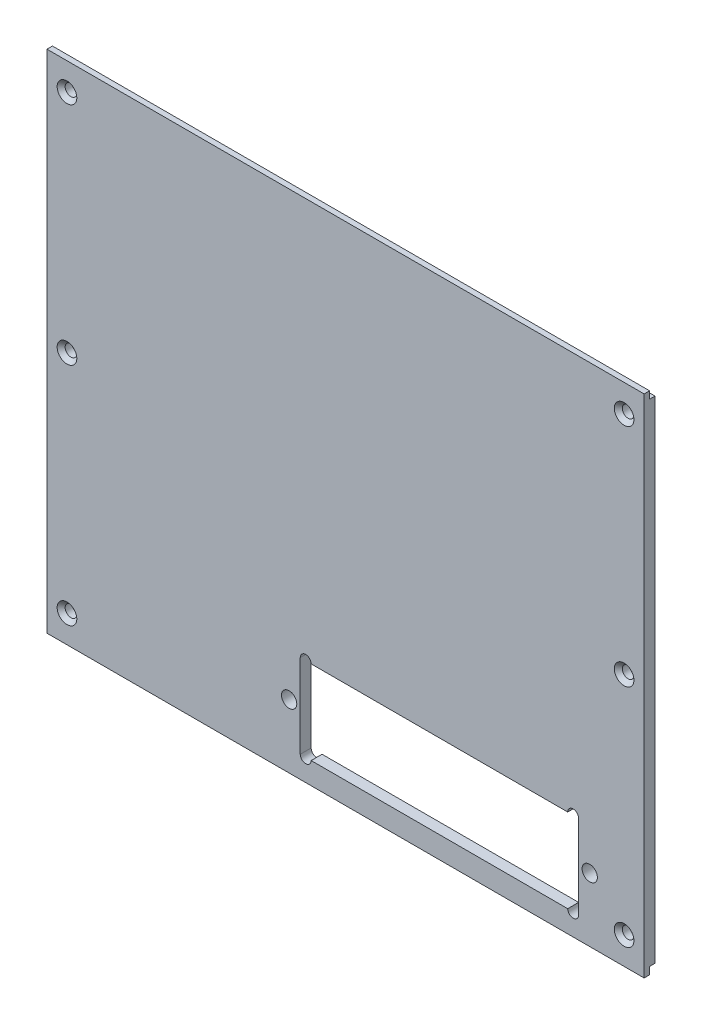
ISO-10303-21;
HEADER;
FILE_DESCRIPTION(('STEP AP214'),'2;1');
FILE_NAME('part.step','',(''),(''),'','','');
FILE_SCHEMA(('AUTOMOTIVE_DESIGN { 1 0 10303 214 1 1 1 1 }'));
ENDSEC;
DATA;
#1=APPLICATION_CONTEXT('core data for automotive mechanical design processes');
#2=APPLICATION_PROTOCOL_DEFINITION('international standard','automotive_design',2000,#1);
#3=PRODUCT_CONTEXT('',#1,'mechanical');
#4=PRODUCT('Part','Part','',(#3));
#5=PRODUCT_RELATED_PRODUCT_CATEGORY('part','',(#4));
#6=PRODUCT_DEFINITION_FORMATION('','',#4);
#7=PRODUCT_DEFINITION_CONTEXT('part definition',#1,'design');
#8=PRODUCT_DEFINITION('design','',#6,#7);
#9=PRODUCT_DEFINITION_SHAPE('','',#8);
#10=(LENGTH_UNIT() NAMED_UNIT(*) SI_UNIT(.MILLI.,.METRE.));
#11=(NAMED_UNIT(*) PLANE_ANGLE_UNIT() SI_UNIT($,.RADIAN.));
#12=(NAMED_UNIT(*) SI_UNIT($,.STERADIAN.) SOLID_ANGLE_UNIT());
#13=UNCERTAINTY_MEASURE_WITH_UNIT(LENGTH_MEASURE(1.E-05),#10,'distance_accuracy_value','');
#14=(GEOMETRIC_REPRESENTATION_CONTEXT(3) GLOBAL_UNCERTAINTY_ASSIGNED_CONTEXT((#13)) GLOBAL_UNIT_ASSIGNED_CONTEXT((#10,
#11,#12)) REPRESENTATION_CONTEXT('',''));
#15=CARTESIAN_POINT('',(0.,0.,0.));
#16=DIRECTION('',(0.,0.,1.));
#17=DIRECTION('',(1.,0.,0.));
#18=AXIS2_PLACEMENT_3D('',#15,#16,#17);
#19=CARTESIAN_POINT('',(-82.05,69.5,3.));
#20=DIRECTION('',(0.,-1.,0.));
#21=DIRECTION('',(0.,0.,-1.));
#22=AXIS2_PLACEMENT_3D('',#19,#20,#21);
#23=PLANE('',#22);
#24=DIRECTION('',(1.,0.,0.));
#25=VECTOR('',#24,1.);
#26=CARTESIAN_POINT('',(82.05,69.5,1.5));
#27=LINE('',#26,#25);
#28=CARTESIAN_POINT('',(-82.05,69.5,1.5));
#29=VERTEX_POINT('',#28);
#30=CARTESIAN_POINT('',(82.05,69.5,1.5));
#31=VERTEX_POINT('',#30);
#32=EDGE_CURVE('E364',#29,#31,#27,.T.);
#33=ORIENTED_EDGE('',*,*,#32,.F.);
#34=DIRECTION('',(0.,0.,-1.));
#35=VECTOR('',#34,1.);
#36=CARTESIAN_POINT('',(-82.05,69.5,3.));
#37=LINE('',#36,#35);
#38=CARTESIAN_POINT('',(-82.05,69.5,3.));
#39=VERTEX_POINT('',#38);
#40=EDGE_CURVE('E183',#39,#29,#37,.T.);
#41=ORIENTED_EDGE('',*,*,#40,.F.);
#42=DIRECTION('',(-1.,0.,0.));
#43=VECTOR('',#42,1.);
#44=CARTESIAN_POINT('',(-82.05,69.5,3.));
#45=LINE('',#44,#43);
#46=CARTESIAN_POINT('',(82.05,69.5,3.));
#47=VERTEX_POINT('',#46);
#48=EDGE_CURVE('E188',#47,#39,#45,.T.);
#49=ORIENTED_EDGE('',*,*,#48,.F.);
#50=DIRECTION('',(0.,0.,-1.));
#51=VECTOR('',#50,1.);
#52=CARTESIAN_POINT('',(82.05,69.5,3.));
#53=LINE('',#52,#51);
#54=EDGE_CURVE('E181',#47,#31,#53,.T.);
#55=ORIENTED_EDGE('',*,*,#54,.T.);
#56=EDGE_LOOP('',(#33,#41,#49,#55));
#57=FACE_BOUND('',#56,.T.);
#58=ADVANCED_FACE('F38',(#57),#23,.F.);
#59=CARTESIAN_POINT('',(0.,0.,3.));
#60=DIRECTION('',(0.,0.,-1.));
#61=DIRECTION('',(-1.,0.,0.));
#62=AXIS2_PLACEMENT_3D('',#59,#60,#61);
#63=PLANE('',#62);
#64=CARTESIAN_POINT('',(67.1,-52.,3.));
#65=DIRECTION('',(0.,0.,1.));
#66=DIRECTION('',(-1.,0.,0.));
#67=AXIS2_PLACEMENT_3D('',#64,#65,#66);
#68=CIRCLE('',#67,2.09999999999999);
#69=CARTESIAN_POINT('',(69.2,-52.,3.));
#70=VERTEX_POINT('',#69);
#71=EDGE_CURVE('E316',#70,#70,#68,.T.);
#72=ORIENTED_EDGE('',*,*,#71,.F.);
#73=EDGE_LOOP('',(#72));
#74=FACE_BOUND('',#73,.T.);
#75=CARTESIAN_POINT('',(-15.5,-52.,3.));
#76=DIRECTION('',(0.,0.,1.));
#77=DIRECTION('',(1.,0.,0.));
#78=AXIS2_PLACEMENT_3D('',#75,#76,#77);
#79=CIRCLE('',#78,2.1);
#80=CARTESIAN_POINT('',(-13.4,-52.,3.));
#81=VERTEX_POINT('',#80);
#82=EDGE_CURVE('E311',#81,#81,#79,.T.);
#83=ORIENTED_EDGE('',*,*,#82,.F.);
#84=EDGE_LOOP('',(#83));
#85=FACE_BOUND('',#84,.T.);
#86=DIRECTION('',(-1.,0.,0.));
#87=VECTOR('',#86,1.);
#88=CARTESIAN_POINT('',(-12.45,-40.5,3.));
#89=LINE('',#88,#87);
#90=CARTESIAN_POINT('',(61.05,-40.5,3.));
#91=VERTEX_POINT('',#90);
#92=CARTESIAN_POINT('',(-9.44999999999999,-40.5,3.));
#93=VERTEX_POINT('',#92);
#94=EDGE_CURVE('E278',#91,#93,#89,.T.);
#95=ORIENTED_EDGE('',*,*,#94,.F.);
#96=CARTESIAN_POINT('',(62.55,-40.5,3.));
#97=DIRECTION('',(0.,0.,1.));
#98=DIRECTION('',(-1.,0.,0.));
#99=AXIS2_PLACEMENT_3D('',#96,#97,#98);
#100=CIRCLE('',#99,1.5);
#101=CARTESIAN_POINT('',(64.05,-40.5,3.));
#102=VERTEX_POINT('',#101);
#103=EDGE_CURVE('E358',#102,#91,#100,.T.);
#104=ORIENTED_EDGE('',*,*,#103,.F.);
#105=DIRECTION('',(0.,1.,0.));
#106=VECTOR('',#105,1.);
#107=CARTESIAN_POINT('',(64.05,-40.5,3.));
#108=LINE('',#107,#106);
#109=CARTESIAN_POINT('',(64.05,-63.5,3.));
#110=VERTEX_POINT('',#109);
#111=EDGE_CURVE('E288',#110,#102,#108,.T.);
#112=ORIENTED_EDGE('',*,*,#111,.F.);
#113=CARTESIAN_POINT('',(62.55,-63.5,3.));
#114=DIRECTION('',(0.,0.,1.));
#115=DIRECTION('',(-1.,0.,0.));
#116=AXIS2_PLACEMENT_3D('',#113,#114,#115);
#117=CIRCLE('',#116,1.5);
#118=CARTESIAN_POINT('',(61.05,-63.5,3.));
#119=VERTEX_POINT('',#118);
#120=EDGE_CURVE('E334',#119,#110,#117,.T.);
#121=ORIENTED_EDGE('',*,*,#120,.F.);
#122=DIRECTION('',(1.,0.,0.));
#123=VECTOR('',#122,1.);
#124=CARTESIAN_POINT('',(-12.45,-63.5,3.));
#125=LINE('',#124,#123);
#126=CARTESIAN_POINT('',(-9.44999999999999,-63.5,3.));
#127=VERTEX_POINT('',#126);
#128=EDGE_CURVE('E292',#127,#119,#125,.T.);
#129=ORIENTED_EDGE('',*,*,#128,.F.);
#130=CARTESIAN_POINT('',(-10.95,-63.5,3.));
#131=DIRECTION('',(0.,0.,1.));
#132=DIRECTION('',(1.,0.,0.));
#133=AXIS2_PLACEMENT_3D('',#130,#131,#132);
#134=CIRCLE('',#133,1.5);
#135=CARTESIAN_POINT('',(-12.45,-63.5,3.));
#136=VERTEX_POINT('',#135);
#137=EDGE_CURVE('E323',#136,#127,#134,.T.);
#138=ORIENTED_EDGE('',*,*,#137,.F.);
#139=DIRECTION('',(0.,-1.,0.));
#140=VECTOR('',#139,1.);
#141=CARTESIAN_POINT('',(-12.45,-40.5,3.));
#142=LINE('',#141,#140);
#143=CARTESIAN_POINT('',(-12.45,-40.5,3.));
#144=VERTEX_POINT('',#143);
#145=EDGE_CURVE('E296',#144,#136,#142,.T.);
#146=ORIENTED_EDGE('',*,*,#145,.F.);
#147=CARTESIAN_POINT('',(-10.95,-40.5,3.));
#148=DIRECTION('',(0.,0.,1.));
#149=DIRECTION('',(1.,0.,0.));
#150=AXIS2_PLACEMENT_3D('',#147,#148,#149);
#151=CIRCLE('',#150,1.5);
#152=EDGE_CURVE('E346',#93,#144,#151,.T.);
#153=ORIENTED_EDGE('',*,*,#152,.F.);
#154=EDGE_LOOP('',(#95,#104,#112,#121,#129,#138,#146,#153));
#155=FACE_BOUND('',#154,.T.);
#156=CARTESIAN_POINT('',(-76.55,0.,3.));
#157=DIRECTION('',(0.,0.,1.));
#158=DIRECTION('',(1.,0.,0.));
#159=AXIS2_PLACEMENT_3D('',#156,#157,#158);
#160=CIRCLE('',#159,2.700000061);
#161=CARTESIAN_POINT('',(-73.849999939,0.,3.));
#162=VERTEX_POINT('',#161);
#163=EDGE_CURVE('E256',#162,#162,#160,.T.);
#164=ORIENTED_EDGE('',*,*,#163,.F.);
#165=EDGE_LOOP('',(#164));
#166=FACE_BOUND('',#165,.T.);
#167=CARTESIAN_POINT('',(-76.55,-62.,3.));
#168=DIRECTION('',(0.,0.,1.));
#169=DIRECTION('',(1.,0.,0.));
#170=AXIS2_PLACEMENT_3D('',#167,#168,#169);
#171=CIRCLE('',#170,2.700000061);
#172=CARTESIAN_POINT('',(-73.849999939,-62.,3.));
#173=VERTEX_POINT('',#172);
#174=EDGE_CURVE('E244',#173,#173,#171,.T.);
#175=ORIENTED_EDGE('',*,*,#174,.F.);
#176=EDGE_LOOP('',(#175));
#177=FACE_BOUND('',#176,.T.);
#178=CARTESIAN_POINT('',(76.55,-62.,3.));
#179=DIRECTION('',(0.,0.,1.));
#180=DIRECTION('',(1.,0.,0.));
#181=AXIS2_PLACEMENT_3D('',#178,#179,#180);
#182=CIRCLE('',#181,2.700000061);
#183=CARTESIAN_POINT('',(79.250000061,-62.,3.));
#184=VERTEX_POINT('',#183);
#185=EDGE_CURVE('E233',#184,#184,#182,.T.);
#186=ORIENTED_EDGE('',*,*,#185,.F.);
#187=EDGE_LOOP('',(#186));
#188=FACE_BOUND('',#187,.T.);
#189=CARTESIAN_POINT('',(76.55,0.,3.));
#190=DIRECTION('',(0.,0.,1.));
#191=DIRECTION('',(1.,0.,0.));
#192=AXIS2_PLACEMENT_3D('',#189,#190,#191);
#193=CIRCLE('',#192,2.700000061);
#194=CARTESIAN_POINT('',(79.250000061,0.,3.));
#195=VERTEX_POINT('',#194);
#196=EDGE_CURVE('E223',#195,#195,#193,.T.);
#197=ORIENTED_EDGE('',*,*,#196,.F.);
#198=EDGE_LOOP('',(#197));
#199=FACE_BOUND('',#198,.T.);
#200=CARTESIAN_POINT('',(76.55,62.,3.));
#201=DIRECTION('',(0.,0.,1.));
#202=DIRECTION('',(1.,0.,0.));
#203=AXIS2_PLACEMENT_3D('',#200,#201,#202);
#204=CIRCLE('',#203,2.700000061);
#205=CARTESIAN_POINT('',(79.250000061,62.,3.));
#206=VERTEX_POINT('',#205);
#207=EDGE_CURVE('E212',#206,#206,#204,.T.);
#208=ORIENTED_EDGE('',*,*,#207,.F.);
#209=EDGE_LOOP('',(#208));
#210=FACE_BOUND('',#209,.T.);
#211=DIRECTION('',(0.,-1.,0.));
#212=VECTOR('',#211,1.);
#213=CARTESIAN_POINT('',(-82.05,-69.5,3.));
#214=LINE('',#213,#212);
#215=CARTESIAN_POINT('',(-82.05,-69.5,3.));
#216=VERTEX_POINT('',#215);
#217=EDGE_CURVE('E191',#39,#216,#214,.T.);
#218=ORIENTED_EDGE('',*,*,#217,.T.);
#219=DIRECTION('',(1.,0.,0.));
#220=VECTOR('',#219,1.);
#221=CARTESIAN_POINT('',(-82.05,-69.5,3.));
#222=LINE('',#221,#220);
#223=CARTESIAN_POINT('',(82.05,-69.5,3.));
#224=VERTEX_POINT('',#223);
#225=EDGE_CURVE('E201',#216,#224,#222,.T.);
#226=ORIENTED_EDGE('',*,*,#225,.T.);
#227=DIRECTION('',(0.,1.,0.));
#228=VECTOR('',#227,1.);
#229=CARTESIAN_POINT('',(82.05,-69.5,3.));
#230=LINE('',#229,#228);
#231=EDGE_CURVE('E180',#224,#47,#230,.T.);
#232=ORIENTED_EDGE('',*,*,#231,.T.);
#233=ORIENTED_EDGE('',*,*,#48,.T.);
#234=EDGE_LOOP('',(#218,#226,#232,#233));
#235=FACE_BOUND('',#234,.T.);
#236=CARTESIAN_POINT('',(-76.55,62.,3.));
#237=DIRECTION('',(0.,0.,1.));
#238=DIRECTION('',(1.,0.,0.));
#239=AXIS2_PLACEMENT_3D('',#236,#237,#238);
#240=CIRCLE('',#239,2.700000061);
#241=CARTESIAN_POINT('',(-73.849999939,62.,3.));
#242=VERTEX_POINT('',#241);
#243=EDGE_CURVE('E266',#242,#242,#240,.T.);
#244=ORIENTED_EDGE('',*,*,#243,.F.);
#245=EDGE_LOOP('',(#244));
#246=FACE_BOUND('',#245,.T.);
#247=ADVANCED_FACE('F406',(#74,#85,#155,#166,#177,#188,#199,#210,#235,#246),#63,.F.);
#248=CARTESIAN_POINT('',(-82.05,-69.5,3.));
#249=DIRECTION('',(1.,0.,0.));
#250=DIRECTION('',(0.,0.,-1.));
#251=AXIS2_PLACEMENT_3D('',#248,#249,#250);
#252=PLANE('',#251);
#253=DIRECTION('',(0.,-1.,0.));
#254=VECTOR('',#253,1.);
#255=CARTESIAN_POINT('',(-82.05,-69.5,0.));
#256=LINE('',#255,#254);
#257=CARTESIAN_POINT('',(-82.05,67.5,0.));
#258=VERTEX_POINT('',#257);
#259=CARTESIAN_POINT('',(-82.05,-67.5,0.));
#260=VERTEX_POINT('',#259);
#261=EDGE_CURVE('E192',#258,#260,#256,.T.);
#262=ORIENTED_EDGE('',*,*,#261,.T.);
#263=DIRECTION('',(0.,0.,-1.));
#264=VECTOR('',#263,1.);
#265=CARTESIAN_POINT('',(-82.05,-67.5,1.5));
#266=LINE('',#265,#264);
#267=CARTESIAN_POINT('',(-82.05,-67.5,1.5));
#268=VERTEX_POINT('',#267);
#269=EDGE_CURVE('E53',#268,#260,#266,.T.);
#270=ORIENTED_EDGE('',*,*,#269,.F.);
#271=DIRECTION('',(0.,1.,0.));
#272=VECTOR('',#271,1.);
#273=CARTESIAN_POINT('',(-82.05,-69.5,1.5));
#274=LINE('',#273,#272);
#275=CARTESIAN_POINT('',(-82.05,-69.5,1.5));
#276=VERTEX_POINT('',#275);
#277=EDGE_CURVE('E176',#276,#268,#274,.T.);
#278=ORIENTED_EDGE('',*,*,#277,.F.);
#279=DIRECTION('',(0.,0.,-1.));
#280=VECTOR('',#279,1.);
#281=CARTESIAN_POINT('',(-82.05,-69.5,3.));
#282=LINE('',#281,#280);
#283=EDGE_CURVE('E11',#216,#276,#282,.T.);
#284=ORIENTED_EDGE('',*,*,#283,.F.);
#285=ORIENTED_EDGE('',*,*,#217,.F.);
#286=ORIENTED_EDGE('',*,*,#40,.T.);
#287=DIRECTION('',(0.,1.,0.));
#288=VECTOR('',#287,1.);
#289=CARTESIAN_POINT('',(-82.05,69.5,1.5));
#290=LINE('',#289,#288);
#291=CARTESIAN_POINT('',(-82.05,67.5,1.5));
#292=VERTEX_POINT('',#291);
#293=EDGE_CURVE('E374',#292,#29,#290,.T.);
#294=ORIENTED_EDGE('',*,*,#293,.F.);
#295=DIRECTION('',(0.,0.,-1.));
#296=VECTOR('',#295,1.);
#297=CARTESIAN_POINT('',(-82.05,67.5,1.5));
#298=LINE('',#297,#296);
#299=EDGE_CURVE('E361',#292,#258,#298,.T.);
#300=ORIENTED_EDGE('',*,*,#299,.T.);
#301=EDGE_LOOP('',(#262,#270,#278,#284,#285,#286,#294,#300));
#302=FACE_BOUND('',#301,.T.);
#303=ADVANCED_FACE('F40',(#302),#252,.F.);
#304=CARTESIAN_POINT('',(-82.05,-69.5,3.));
#305=DIRECTION('',(0.,1.,0.));
#306=DIRECTION('',(0.,0.,1.));
#307=AXIS2_PLACEMENT_3D('',#304,#305,#306);
#308=PLANE('',#307);
#309=ORIENTED_EDGE('',*,*,#283,.T.);
#310=DIRECTION('',(-1.,0.,0.));
#311=VECTOR('',#310,1.);
#312=CARTESIAN_POINT('',(82.05,-69.5,1.5));
#313=LINE('',#312,#311);
#314=CARTESIAN_POINT('',(82.05,-69.5,1.5));
#315=VERTEX_POINT('',#314);
#316=EDGE_CURVE('E164',#315,#276,#313,.T.);
#317=ORIENTED_EDGE('',*,*,#316,.F.);
#318=DIRECTION('',(0.,0.,-1.));
#319=VECTOR('',#318,1.);
#320=CARTESIAN_POINT('',(82.05,-69.5,3.));
#321=LINE('',#320,#319);
#322=EDGE_CURVE('E46',#224,#315,#321,.T.);
#323=ORIENTED_EDGE('',*,*,#322,.F.);
#324=ORIENTED_EDGE('',*,*,#225,.F.);
#325=EDGE_LOOP('',(#309,#317,#323,#324));
#326=FACE_BOUND('',#325,.T.);
#327=ADVANCED_FACE('F172',(#326),#308,.F.);
#328=CARTESIAN_POINT('',(82.05,-69.5,3.));
#329=DIRECTION('',(-1.,0.,0.));
#330=DIRECTION('',(0.,0.,1.));
#331=AXIS2_PLACEMENT_3D('',#328,#329,#330);
#332=PLANE('',#331);
#333=DIRECTION('',(0.,-1.,0.));
#334=VECTOR('',#333,1.);
#335=CARTESIAN_POINT('',(82.05,-69.5,1.5));
#336=LINE('',#335,#334);
#337=CARTESIAN_POINT('',(82.05,-67.5,1.5));
#338=VERTEX_POINT('',#337);
#339=EDGE_CURVE('E161',#338,#315,#336,.T.);
#340=ORIENTED_EDGE('',*,*,#339,.F.);
#341=DIRECTION('',(0.,0.,-1.));
#342=VECTOR('',#341,1.);
#343=CARTESIAN_POINT('',(82.05,-67.5,1.5));
#344=LINE('',#343,#342);
#345=CARTESIAN_POINT('',(82.05,-67.5,0.));
#346=VERTEX_POINT('',#345);
#347=EDGE_CURVE('E371',#338,#346,#344,.T.);
#348=ORIENTED_EDGE('',*,*,#347,.T.);
#349=DIRECTION('',(0.,1.,0.));
#350=VECTOR('',#349,1.);
#351=CARTESIAN_POINT('',(82.05,-69.5,0.));
#352=LINE('',#351,#350);
#353=CARTESIAN_POINT('',(82.05,67.5,0.));
#354=VERTEX_POINT('',#353);
#355=EDGE_CURVE('E61',#346,#354,#352,.T.);
#356=ORIENTED_EDGE('',*,*,#355,.T.);
#357=DIRECTION('',(0.,0.,-1.));
#358=VECTOR('',#357,1.);
#359=CARTESIAN_POINT('',(82.05,67.5,1.5));
#360=LINE('',#359,#358);
#361=CARTESIAN_POINT('',(82.05,67.5,1.5));
#362=VERTEX_POINT('',#361);
#363=EDGE_CURVE('E362',#362,#354,#360,.T.);
#364=ORIENTED_EDGE('',*,*,#363,.F.);
#365=DIRECTION('',(0.,-1.,0.));
#366=VECTOR('',#365,1.);
#367=CARTESIAN_POINT('',(82.05,69.5,1.5));
#368=LINE('',#367,#366);
#369=EDGE_CURVE('E370',#31,#362,#368,.T.);
#370=ORIENTED_EDGE('',*,*,#369,.F.);
#371=ORIENTED_EDGE('',*,*,#54,.F.);
#372=ORIENTED_EDGE('',*,*,#231,.F.);
#373=ORIENTED_EDGE('',*,*,#322,.T.);
#374=EDGE_LOOP('',(#340,#348,#356,#364,#370,#371,#372,#373));
#375=FACE_BOUND('',#374,.T.);
#376=ADVANCED_FACE('F178',(#375),#332,.F.);
#377=CARTESIAN_POINT('',(0.,0.,0.));
#378=DIRECTION('',(0.,0.,-1.));
#379=DIRECTION('',(-1.,0.,0.));
#380=AXIS2_PLACEMENT_3D('',#377,#378,#379);
#381=PLANE('',#380);
#382=DIRECTION('',(1.,0.,0.));
#383=VECTOR('',#382,1.);
#384=CARTESIAN_POINT('',(82.05,-67.5,0.));
#385=LINE('',#384,#383);
#386=EDGE_CURVE('E168',#260,#346,#385,.T.);
#387=ORIENTED_EDGE('',*,*,#386,.F.);
#388=ORIENTED_EDGE('',*,*,#261,.F.);
#389=DIRECTION('',(-1.,0.,0.));
#390=VECTOR('',#389,1.);
#391=CARTESIAN_POINT('',(82.05,67.5,0.));
#392=LINE('',#391,#390);
#393=EDGE_CURVE('E367',#354,#258,#392,.T.);
#394=ORIENTED_EDGE('',*,*,#393,.F.);
#395=ORIENTED_EDGE('',*,*,#355,.F.);
#396=EDGE_LOOP('',(#387,#388,#394,#395));
#397=FACE_BOUND('',#396,.T.);
#398=CARTESIAN_POINT('',(62.55,-40.5,0.));
#399=DIRECTION('',(0.,0.,-1.));
#400=DIRECTION('',(-1.,0.,0.));
#401=AXIS2_PLACEMENT_3D('',#398,#399,#400);
#402=CIRCLE('',#401,1.5);
#403=CARTESIAN_POINT('',(64.05,-40.5,0.));
#404=VERTEX_POINT('',#403);
#405=CARTESIAN_POINT('',(61.05,-40.5,0.));
#406=VERTEX_POINT('',#405);
#407=EDGE_CURVE('E354',#404,#406,#402,.F.);
#408=ORIENTED_EDGE('',*,*,#407,.T.);
#409=DIRECTION('',(-1.,0.,0.));
#410=VECTOR('',#409,1.);
#411=CARTESIAN_POINT('',(-12.45,-40.5,0.));
#412=LINE('',#411,#410);
#413=CARTESIAN_POINT('',(-9.44999999999999,-40.5,0.));
#414=VERTEX_POINT('',#413);
#415=EDGE_CURVE('E304',#406,#414,#412,.T.);
#416=ORIENTED_EDGE('',*,*,#415,.T.);
#417=CARTESIAN_POINT('',(-10.95,-40.5,0.));
#418=DIRECTION('',(0.,0.,-1.));
#419=DIRECTION('',(-1.,0.,0.));
#420=AXIS2_PLACEMENT_3D('',#417,#418,#419);
#421=CIRCLE('',#420,1.5);
#422=CARTESIAN_POINT('',(-12.45,-40.5,0.));
#423=VERTEX_POINT('',#422);
#424=EDGE_CURVE('E341',#414,#423,#421,.F.);
#425=ORIENTED_EDGE('',*,*,#424,.T.);
#426=DIRECTION('',(0.,-1.,0.));
#427=VECTOR('',#426,1.);
#428=CARTESIAN_POINT('',(-12.45,-40.5,0.));
#429=LINE('',#428,#427);
#430=CARTESIAN_POINT('',(-12.45,-63.5,0.));
#431=VERTEX_POINT('',#430);
#432=EDGE_CURVE('E300',#423,#431,#429,.T.);
#433=ORIENTED_EDGE('',*,*,#432,.T.);
#434=CARTESIAN_POINT('',(-10.95,-63.5,0.));
#435=DIRECTION('',(0.,0.,-1.));
#436=DIRECTION('',(-1.,0.,0.));
#437=AXIS2_PLACEMENT_3D('',#434,#435,#436);
#438=CIRCLE('',#437,1.5);
#439=CARTESIAN_POINT('',(-9.44999999999999,-63.5,0.));
#440=VERTEX_POINT('',#439);
#441=EDGE_CURVE('E328',#431,#440,#438,.F.);
#442=ORIENTED_EDGE('',*,*,#441,.T.);
#443=DIRECTION('',(1.,0.,0.));
#444=VECTOR('',#443,1.);
#445=CARTESIAN_POINT('',(-12.45,-63.5,0.));
#446=LINE('',#445,#444);
#447=CARTESIAN_POINT('',(61.05,-63.5,0.));
#448=VERTEX_POINT('',#447);
#449=EDGE_CURVE('E269',#440,#448,#446,.T.);
#450=ORIENTED_EDGE('',*,*,#449,.T.);
#451=CARTESIAN_POINT('',(62.55,-63.5,0.));
#452=DIRECTION('',(0.,0.,-1.));
#453=DIRECTION('',(-1.,0.,0.));
#454=AXIS2_PLACEMENT_3D('',#451,#452,#453);
#455=CIRCLE('',#454,1.5);
#456=CARTESIAN_POINT('',(64.05,-63.5,0.));
#457=VERTEX_POINT('',#456);
#458=EDGE_CURVE('E336',#448,#457,#455,.F.);
#459=ORIENTED_EDGE('',*,*,#458,.T.);
#460=DIRECTION('',(0.,1.,0.));
#461=VECTOR('',#460,1.);
#462=CARTESIAN_POINT('',(64.05,-40.5,0.));
#463=LINE('',#462,#461);
#464=EDGE_CURVE('E307',#457,#404,#463,.T.);
#465=ORIENTED_EDGE('',*,*,#464,.T.);
#466=EDGE_LOOP('',(#408,#416,#425,#433,#442,#450,#459,#465));
#467=FACE_BOUND('',#466,.T.);
#468=CARTESIAN_POINT('',(67.1,-52.,0.));
#469=DIRECTION('',(0.,0.,-1.));
#470=DIRECTION('',(-1.,0.,0.));
#471=AXIS2_PLACEMENT_3D('',#468,#469,#470);
#472=CIRCLE('',#471,2.09999999999999);
#473=CARTESIAN_POINT('',(69.2,-52.,0.));
#474=VERTEX_POINT('',#473);
#475=EDGE_CURVE('E320',#474,#474,#472,.F.);
#476=ORIENTED_EDGE('',*,*,#475,.T.);
#477=EDGE_LOOP('',(#476));
#478=FACE_BOUND('',#477,.T.);
#479=CARTESIAN_POINT('',(-15.5,-52.,0.));
#480=DIRECTION('',(0.,0.,-1.));
#481=DIRECTION('',(-1.,0.,0.));
#482=AXIS2_PLACEMENT_3D('',#479,#480,#481);
#483=CIRCLE('',#482,2.1);
#484=CARTESIAN_POINT('',(-13.4,-52.,0.));
#485=VERTEX_POINT('',#484);
#486=EDGE_CURVE('E312',#485,#485,#483,.F.);
#487=ORIENTED_EDGE('',*,*,#486,.T.);
#488=EDGE_LOOP('',(#487));
#489=FACE_BOUND('',#488,.T.);
#490=CARTESIAN_POINT('',(-76.55,62.,0.));
#491=DIRECTION('',(0.,0.,-1.));
#492=DIRECTION('',(-1.,0.,0.));
#493=AXIS2_PLACEMENT_3D('',#490,#491,#492);
#494=CIRCLE('',#493,1.599999975);
#495=CARTESIAN_POINT('',(-78.149999975,62.,0.));
#496=VERTEX_POINT('',#495);
#497=EDGE_CURVE('E260',#496,#496,#494,.T.);
#498=ORIENTED_EDGE('',*,*,#497,.F.);
#499=EDGE_LOOP('',(#498));
#500=FACE_BOUND('',#499,.T.);
#501=CARTESIAN_POINT('',(-76.55,0.,0.));
#502=DIRECTION('',(0.,0.,-1.));
#503=DIRECTION('',(-1.,0.,0.));
#504=AXIS2_PLACEMENT_3D('',#501,#502,#503);
#505=CIRCLE('',#504,1.599999975);
#506=CARTESIAN_POINT('',(-78.149999975,0.,0.));
#507=VERTEX_POINT('',#506);
#508=EDGE_CURVE('E248',#507,#507,#505,.T.);
#509=ORIENTED_EDGE('',*,*,#508,.F.);
#510=EDGE_LOOP('',(#509));
#511=FACE_BOUND('',#510,.T.);
#512=CARTESIAN_POINT('',(-76.55,-62.,0.));
#513=DIRECTION('',(0.,0.,-1.));
#514=DIRECTION('',(-1.,0.,0.));
#515=AXIS2_PLACEMENT_3D('',#512,#513,#514);
#516=CIRCLE('',#515,1.599999975);
#517=CARTESIAN_POINT('',(-78.149999975,-62.,0.));
#518=VERTEX_POINT('',#517);
#519=EDGE_CURVE('E236',#518,#518,#516,.T.);
#520=ORIENTED_EDGE('',*,*,#519,.F.);
#521=EDGE_LOOP('',(#520));
#522=FACE_BOUND('',#521,.T.);
#523=CARTESIAN_POINT('',(76.55,-62.,0.));
#524=DIRECTION('',(0.,0.,-1.));
#525=DIRECTION('',(-1.,0.,0.));
#526=AXIS2_PLACEMENT_3D('',#523,#524,#525);
#527=CIRCLE('',#526,1.599999975);
#528=CARTESIAN_POINT('',(74.950000025,-62.,0.));
#529=VERTEX_POINT('',#528);
#530=EDGE_CURVE('E227',#529,#529,#527,.T.);
#531=ORIENTED_EDGE('',*,*,#530,.F.);
#532=EDGE_LOOP('',(#531));
#533=FACE_BOUND('',#532,.T.);
#534=CARTESIAN_POINT('',(76.55,0.,0.));
#535=DIRECTION('',(0.,0.,-1.));
#536=DIRECTION('',(-1.,0.,0.));
#537=AXIS2_PLACEMENT_3D('',#534,#535,#536);
#538=CIRCLE('',#537,1.599999975);
#539=CARTESIAN_POINT('',(74.950000025,0.,0.));
#540=VERTEX_POINT('',#539);
#541=EDGE_CURVE('E215',#540,#540,#538,.T.);
#542=ORIENTED_EDGE('',*,*,#541,.F.);
#543=EDGE_LOOP('',(#542));
#544=FACE_BOUND('',#543,.T.);
#545=CARTESIAN_POINT('',(76.55,62.,0.));
#546=DIRECTION('',(0.,0.,-1.));
#547=DIRECTION('',(-1.,0.,0.));
#548=AXIS2_PLACEMENT_3D('',#545,#546,#547);
#549=CIRCLE('',#548,1.599999975);
#550=CARTESIAN_POINT('',(74.950000025,62.,0.));
#551=VERTEX_POINT('',#550);
#552=EDGE_CURVE('E196',#551,#551,#549,.T.);
#553=ORIENTED_EDGE('',*,*,#552,.F.);
#554=EDGE_LOOP('',(#553));
#555=FACE_BOUND('',#554,.T.);
#556=ADVANCED_FACE('F394',(#397,#467,#478,#489,#500,#511,#522,#533,#544,#555),#381,.T.);
#557=CARTESIAN_POINT('',(76.55,62.,3.));
#558=DIRECTION('',(0.,0.,1.));
#559=DIRECTION('',(1.,0.,0.));
#560=AXIS2_PLACEMENT_3D('',#557,#558,#559);
#561=CYLINDRICAL_SURFACE('',#560,1.599999975);
#562=CARTESIAN_POINT('',(76.55,62.,1.899999914));
#563=DIRECTION('',(0.,0.,1.));
#564=DIRECTION('',(1.,0.,0.));
#565=AXIS2_PLACEMENT_3D('',#562,#563,#564);
#566=CIRCLE('',#565,1.599999975);
#567=CARTESIAN_POINT('',(78.149999975,62.,1.899999914));
#568=VERTEX_POINT('',#567);
#569=EDGE_CURVE('E209',#568,#568,#566,.T.);
#570=ORIENTED_EDGE('',*,*,#569,.T.);
#571=EDGE_LOOP('',(#570));
#572=FACE_BOUND('',#571,.T.);
#573=ORIENTED_EDGE('',*,*,#552,.T.);
#574=EDGE_LOOP('',(#573));
#575=FACE_BOUND('',#574,.T.);
#576=ADVANCED_FACE('F453',(#572,#575),#561,.F.);
#577=CARTESIAN_POINT('',(76.55,62.,3.));
#578=DIRECTION('',(0.,0.,1.));
#579=DIRECTION('',(1.,0.,0.));
#580=AXIS2_PLACEMENT_3D('',#577,#578,#579);
#581=CONICAL_SURFACE('',#580,2.700000061,0.785398163397449);
#582=ORIENTED_EDGE('',*,*,#569,.F.);
#583=EDGE_LOOP('',(#582));
#584=FACE_BOUND('',#583,.T.);
#585=ORIENTED_EDGE('',*,*,#207,.T.);
#586=EDGE_LOOP('',(#585));
#587=FACE_BOUND('',#586,.T.);
#588=ADVANCED_FACE('F457',(#584,#587),#581,.F.);
#589=CARTESIAN_POINT('',(76.55,0.,3.));
#590=DIRECTION('',(0.,0.,1.));
#591=DIRECTION('',(1.,0.,0.));
#592=AXIS2_PLACEMENT_3D('',#589,#590,#591);
#593=CYLINDRICAL_SURFACE('',#592,1.599999975);
#594=CARTESIAN_POINT('',(76.55,0.,1.899999914));
#595=DIRECTION('',(0.,0.,1.));
#596=DIRECTION('',(1.,0.,0.));
#597=AXIS2_PLACEMENT_3D('',#594,#595,#596);
#598=CIRCLE('',#597,1.599999975);
#599=CARTESIAN_POINT('',(78.149999975,0.,1.899999914));
#600=VERTEX_POINT('',#599);
#601=EDGE_CURVE('E219',#600,#600,#598,.T.);
#602=ORIENTED_EDGE('',*,*,#601,.T.);
#603=EDGE_LOOP('',(#602));
#604=FACE_BOUND('',#603,.T.);
#605=ORIENTED_EDGE('',*,*,#541,.T.);
#606=EDGE_LOOP('',(#605));
#607=FACE_BOUND('',#606,.T.);
#608=ADVANCED_FACE('F465',(#604,#607),#593,.F.);
#609=CARTESIAN_POINT('',(76.55,0.,3.));
#610=DIRECTION('',(0.,0.,1.));
#611=DIRECTION('',(1.,0.,0.));
#612=AXIS2_PLACEMENT_3D('',#609,#610,#611);
#613=CONICAL_SURFACE('',#612,2.700000061,0.785398163397449);
#614=ORIENTED_EDGE('',*,*,#601,.F.);
#615=EDGE_LOOP('',(#614));
#616=FACE_BOUND('',#615,.T.);
#617=ORIENTED_EDGE('',*,*,#196,.T.);
#618=EDGE_LOOP('',(#617));
#619=FACE_BOUND('',#618,.T.);
#620=ADVANCED_FACE('F473',(#616,#619),#613,.F.);
#621=CARTESIAN_POINT('',(76.55,-62.,3.));
#622=DIRECTION('',(0.,0.,1.));
#623=DIRECTION('',(1.,0.,0.));
#624=AXIS2_PLACEMENT_3D('',#621,#622,#623);
#625=CYLINDRICAL_SURFACE('',#624,1.599999975);
#626=CARTESIAN_POINT('',(76.55,-62.,1.899999914));
#627=DIRECTION('',(0.,0.,1.));
#628=DIRECTION('',(1.,0.,0.));
#629=AXIS2_PLACEMENT_3D('',#626,#627,#628);
#630=CIRCLE('',#629,1.599999975);
#631=CARTESIAN_POINT('',(78.149999975,-62.,1.899999914));
#632=VERTEX_POINT('',#631);
#633=EDGE_CURVE('E230',#632,#632,#630,.T.);
#634=ORIENTED_EDGE('',*,*,#633,.T.);
#635=EDGE_LOOP('',(#634));
#636=FACE_BOUND('',#635,.T.);
#637=ORIENTED_EDGE('',*,*,#530,.T.);
#638=EDGE_LOOP('',(#637));
#639=FACE_BOUND('',#638,.T.);
#640=ADVANCED_FACE('F481',(#636,#639),#625,.F.);
#641=CARTESIAN_POINT('',(76.55,-62.,3.));
#642=DIRECTION('',(0.,0.,1.));
#643=DIRECTION('',(1.,0.,0.));
#644=AXIS2_PLACEMENT_3D('',#641,#642,#643);
#645=CONICAL_SURFACE('',#644,2.700000061,0.785398163397449);
#646=ORIENTED_EDGE('',*,*,#633,.F.);
#647=EDGE_LOOP('',(#646));
#648=FACE_BOUND('',#647,.T.);
#649=ORIENTED_EDGE('',*,*,#185,.T.);
#650=EDGE_LOOP('',(#649));
#651=FACE_BOUND('',#650,.T.);
#652=ADVANCED_FACE('F489',(#648,#651),#645,.F.);
#653=CARTESIAN_POINT('',(-76.55,-62.,3.));
#654=DIRECTION('',(0.,0.,1.));
#655=DIRECTION('',(1.,0.,0.));
#656=AXIS2_PLACEMENT_3D('',#653,#654,#655);
#657=CYLINDRICAL_SURFACE('',#656,1.599999975);
#658=CARTESIAN_POINT('',(-76.55,-62.,1.899999914));
#659=DIRECTION('',(0.,0.,1.));
#660=DIRECTION('',(1.,0.,0.));
#661=AXIS2_PLACEMENT_3D('',#658,#659,#660);
#662=CIRCLE('',#661,1.599999975);
#663=CARTESIAN_POINT('',(-74.950000025,-62.,1.899999914));
#664=VERTEX_POINT('',#663);
#665=EDGE_CURVE('E240',#664,#664,#662,.T.);
#666=ORIENTED_EDGE('',*,*,#665,.T.);
#667=EDGE_LOOP('',(#666));
#668=FACE_BOUND('',#667,.T.);
#669=ORIENTED_EDGE('',*,*,#519,.T.);
#670=EDGE_LOOP('',(#669));
#671=FACE_BOUND('',#670,.T.);
#672=ADVANCED_FACE('F497',(#668,#671),#657,.F.);
#673=CARTESIAN_POINT('',(-76.55,-62.,3.));
#674=DIRECTION('',(0.,0.,1.));
#675=DIRECTION('',(1.,0.,0.));
#676=AXIS2_PLACEMENT_3D('',#673,#674,#675);
#677=CONICAL_SURFACE('',#676,2.700000061,0.785398163397449);
#678=ORIENTED_EDGE('',*,*,#665,.F.);
#679=EDGE_LOOP('',(#678));
#680=FACE_BOUND('',#679,.T.);
#681=ORIENTED_EDGE('',*,*,#174,.T.);
#682=EDGE_LOOP('',(#681));
#683=FACE_BOUND('',#682,.T.);
#684=ADVANCED_FACE('F505',(#680,#683),#677,.F.);
#685=CARTESIAN_POINT('',(-76.55,0.,3.));
#686=DIRECTION('',(0.,0.,1.));
#687=DIRECTION('',(1.,0.,0.));
#688=AXIS2_PLACEMENT_3D('',#685,#686,#687);
#689=CYLINDRICAL_SURFACE('',#688,1.599999975);
#690=CARTESIAN_POINT('',(-76.55,0.,1.899999914));
#691=DIRECTION('',(0.,0.,1.));
#692=DIRECTION('',(1.,0.,0.));
#693=AXIS2_PLACEMENT_3D('',#690,#691,#692);
#694=CIRCLE('',#693,1.599999975);
#695=CARTESIAN_POINT('',(-74.950000025,0.,1.899999914));
#696=VERTEX_POINT('',#695);
#697=EDGE_CURVE('E252',#696,#696,#694,.T.);
#698=ORIENTED_EDGE('',*,*,#697,.T.);
#699=EDGE_LOOP('',(#698));
#700=FACE_BOUND('',#699,.T.);
#701=ORIENTED_EDGE('',*,*,#508,.T.);
#702=EDGE_LOOP('',(#701));
#703=FACE_BOUND('',#702,.T.);
#704=ADVANCED_FACE('F513',(#700,#703),#689,.F.);
#705=CARTESIAN_POINT('',(-76.55,0.,3.));
#706=DIRECTION('',(0.,0.,1.));
#707=DIRECTION('',(1.,0.,0.));
#708=AXIS2_PLACEMENT_3D('',#705,#706,#707);
#709=CONICAL_SURFACE('',#708,2.700000061,0.785398163397449);
#710=ORIENTED_EDGE('',*,*,#697,.F.);
#711=EDGE_LOOP('',(#710));
#712=FACE_BOUND('',#711,.T.);
#713=ORIENTED_EDGE('',*,*,#163,.T.);
#714=EDGE_LOOP('',(#713));
#715=FACE_BOUND('',#714,.T.);
#716=ADVANCED_FACE('F521',(#712,#715),#709,.F.);
#717=CARTESIAN_POINT('',(-76.55,62.,3.));
#718=DIRECTION('',(0.,0.,1.));
#719=DIRECTION('',(1.,0.,0.));
#720=AXIS2_PLACEMENT_3D('',#717,#718,#719);
#721=CYLINDRICAL_SURFACE('',#720,1.599999975);
#722=CARTESIAN_POINT('',(-76.55,62.,1.899999914));
#723=DIRECTION('',(0.,0.,1.));
#724=DIRECTION('',(1.,0.,0.));
#725=AXIS2_PLACEMENT_3D('',#722,#723,#724);
#726=CIRCLE('',#725,1.599999975);
#727=CARTESIAN_POINT('',(-74.950000025,62.,1.899999914));
#728=VERTEX_POINT('',#727);
#729=EDGE_CURVE('E263',#728,#728,#726,.T.);
#730=ORIENTED_EDGE('',*,*,#729,.T.);
#731=EDGE_LOOP('',(#730));
#732=FACE_BOUND('',#731,.T.);
#733=ORIENTED_EDGE('',*,*,#497,.T.);
#734=EDGE_LOOP('',(#733));
#735=FACE_BOUND('',#734,.T.);
#736=ADVANCED_FACE('F529',(#732,#735),#721,.F.);
#737=CARTESIAN_POINT('',(-76.55,62.,3.));
#738=DIRECTION('',(0.,0.,1.));
#739=DIRECTION('',(1.,0.,0.));
#740=AXIS2_PLACEMENT_3D('',#737,#738,#739);
#741=CONICAL_SURFACE('',#740,2.700000061,0.785398163397449);
#742=ORIENTED_EDGE('',*,*,#729,.F.);
#743=EDGE_LOOP('',(#742));
#744=FACE_BOUND('',#743,.T.);
#745=ORIENTED_EDGE('',*,*,#243,.T.);
#746=EDGE_LOOP('',(#745));
#747=FACE_BOUND('',#746,.T.);
#748=ADVANCED_FACE('F537',(#744,#747),#741,.F.);
#749=CARTESIAN_POINT('',(-12.45,-40.5,-0.00100000000000013));
#750=DIRECTION('',(-1.,0.,0.));
#751=DIRECTION('',(0.,0.,1.));
#752=AXIS2_PLACEMENT_3D('',#749,#750,#751);
#753=PLANE('',#752);
#754=DIRECTION('',(0.,0.,1.));
#755=VECTOR('',#754,1.);
#756=CARTESIAN_POINT('',(-12.45,-40.5,-0.00100000000000013));
#757=LINE('',#756,#755);
#758=EDGE_CURVE('E273',#423,#144,#757,.T.);
#759=ORIENTED_EDGE('',*,*,#758,.T.);
#760=ORIENTED_EDGE('',*,*,#145,.T.);
#761=DIRECTION('',(0.,0.,1.));
#762=VECTOR('',#761,1.);
#763=CARTESIAN_POINT('',(-12.45,-63.5,-0.00100000000000013));
#764=LINE('',#763,#762);
#765=EDGE_CURVE('E274',#431,#136,#764,.T.);
#766=ORIENTED_EDGE('',*,*,#765,.F.);
#767=ORIENTED_EDGE('',*,*,#432,.F.);
#768=EDGE_LOOP('',(#759,#760,#766,#767));
#769=FACE_BOUND('',#768,.T.);
#770=ADVANCED_FACE('F545',(#769),#753,.F.);
#771=CARTESIAN_POINT('',(-12.45,-40.5,-0.00100000000000013));
#772=DIRECTION('',(0.,1.,0.));
#773=DIRECTION('',(0.,0.,1.));
#774=AXIS2_PLACEMENT_3D('',#771,#772,#773);
#775=PLANE('',#774);
#776=ORIENTED_EDGE('',*,*,#415,.F.);
#777=DIRECTION('',(0.,0.,1.));
#778=VECTOR('',#777,1.);
#779=CARTESIAN_POINT('',(61.05,-40.5,-0.00100000000000013));
#780=LINE('',#779,#778);
#781=EDGE_CURVE('E347',#91,#406,#780,.F.);
#782=ORIENTED_EDGE('',*,*,#781,.F.);
#783=ORIENTED_EDGE('',*,*,#94,.T.);
#784=DIRECTION('',(0.,0.,1.));
#785=VECTOR('',#784,1.);
#786=CARTESIAN_POINT('',(-9.44999999999999,-40.5,-0.00100000000000013));
#787=LINE('',#786,#785);
#788=EDGE_CURVE('E342',#414,#93,#787,.T.);
#789=ORIENTED_EDGE('',*,*,#788,.F.);
#790=EDGE_LOOP('',(#776,#782,#783,#789));
#791=FACE_BOUND('',#790,.T.);
#792=ADVANCED_FACE('F553',(#791),#775,.F.);
#793=CARTESIAN_POINT('',(64.05,-40.5,-0.00100000000000013));
#794=DIRECTION('',(1.,0.,0.));
#795=DIRECTION('',(0.,0.,-1.));
#796=AXIS2_PLACEMENT_3D('',#793,#794,#795);
#797=PLANE('',#796);
#798=DIRECTION('',(0.,0.,1.));
#799=VECTOR('',#798,1.);
#800=CARTESIAN_POINT('',(64.05,-63.5,-0.00100000000000013));
#801=LINE('',#800,#799);
#802=EDGE_CURVE('E277',#457,#110,#801,.T.);
#803=ORIENTED_EDGE('',*,*,#802,.T.);
#804=ORIENTED_EDGE('',*,*,#111,.T.);
#805=DIRECTION('',(0.,0.,1.));
#806=VECTOR('',#805,1.);
#807=CARTESIAN_POINT('',(64.05,-40.5,-0.00100000000000013));
#808=LINE('',#807,#806);
#809=EDGE_CURVE('E281',#404,#102,#808,.T.);
#810=ORIENTED_EDGE('',*,*,#809,.F.);
#811=ORIENTED_EDGE('',*,*,#464,.F.);
#812=EDGE_LOOP('',(#803,#804,#810,#811));
#813=FACE_BOUND('',#812,.T.);
#814=ADVANCED_FACE('F561',(#813),#797,.F.);
#815=CARTESIAN_POINT('',(-12.45,-63.5,-0.00100000000000013));
#816=DIRECTION('',(0.,-1.,0.));
#817=DIRECTION('',(0.,0.,-1.));
#818=AXIS2_PLACEMENT_3D('',#815,#816,#817);
#819=PLANE('',#818);
#820=ORIENTED_EDGE('',*,*,#128,.T.);
#821=DIRECTION('',(0.,0.,1.));
#822=VECTOR('',#821,1.);
#823=CARTESIAN_POINT('',(61.05,-63.5,-0.00100000000000013));
#824=LINE('',#823,#822);
#825=EDGE_CURVE('E339',#448,#119,#824,.T.);
#826=ORIENTED_EDGE('',*,*,#825,.F.);
#827=ORIENTED_EDGE('',*,*,#449,.F.);
#828=DIRECTION('',(0.,0.,-1.));
#829=VECTOR('',#828,1.);
#830=CARTESIAN_POINT('',(-9.44999999999999,-63.5,-0.00100000000000013));
#831=LINE('',#830,#829);
#832=EDGE_CURVE('E332',#127,#440,#831,.T.);
#833=ORIENTED_EDGE('',*,*,#832,.F.);
#834=EDGE_LOOP('',(#820,#826,#827,#833));
#835=FACE_BOUND('',#834,.T.);
#836=ADVANCED_FACE('F568',(#835),#819,.F.);
#837=CARTESIAN_POINT('',(-15.5,-52.,-0.00100000000000013));
#838=DIRECTION('',(0.,0.,1.));
#839=DIRECTION('',(1.,0.,0.));
#840=AXIS2_PLACEMENT_3D('',#837,#838,#839);
#841=CYLINDRICAL_SURFACE('',#840,2.1);
#842=CARTESIAN_POINT('',(-13.4,-52.,0.));
#843=CARTESIAN_POINT('',(-13.4,-52.,0.03125));
#844=CARTESIAN_POINT('',(-13.4,-52.,0.0625));
#845=CARTESIAN_POINT('',(-13.4,-52.,0.125));
#846=CARTESIAN_POINT('',(-13.4,-52.,0.15625));
#847=CARTESIAN_POINT('',(-13.4,-52.,0.21875));
#848=CARTESIAN_POINT('',(-13.4,-52.,0.25));
#849=CARTESIAN_POINT('',(-13.4,-52.,0.3125));
#850=CARTESIAN_POINT('',(-13.4,-52.,0.34375));
#851=CARTESIAN_POINT('',(-13.4,-52.,0.40625));
#852=CARTESIAN_POINT('',(-13.4,-52.,0.4375));
#853=CARTESIAN_POINT('',(-13.4,-52.,0.5));
#854=CARTESIAN_POINT('',(-13.4,-52.,0.53125));
#855=CARTESIAN_POINT('',(-13.4,-52.,0.59375));
#856=CARTESIAN_POINT('',(-13.4,-52.,0.625));
#857=CARTESIAN_POINT('',(-13.4,-52.,0.6875));
#858=CARTESIAN_POINT('',(-13.4,-52.,0.71875));
#859=CARTESIAN_POINT('',(-13.4,-52.,0.78125));
#860=CARTESIAN_POINT('',(-13.4,-52.,0.8125));
#861=CARTESIAN_POINT('',(-13.4,-52.,0.875));
#862=CARTESIAN_POINT('',(-13.4,-52.,0.90625));
#863=CARTESIAN_POINT('',(-13.4,-52.,0.96875));
#864=CARTESIAN_POINT('',(-13.4,-52.,1.));
#865=CARTESIAN_POINT('',(-13.4,-52.,1.0625));
#866=CARTESIAN_POINT('',(-13.4,-52.,1.09375));
#867=CARTESIAN_POINT('',(-13.4,-52.,1.15625));
#868=CARTESIAN_POINT('',(-13.4,-52.,1.1875));
#869=CARTESIAN_POINT('',(-13.4,-52.,1.25));
#870=CARTESIAN_POINT('',(-13.4,-52.,1.28125));
#871=CARTESIAN_POINT('',(-13.4,-52.,1.34375));
#872=CARTESIAN_POINT('',(-13.4,-52.,1.375));
#873=CARTESIAN_POINT('',(-13.4,-52.,1.4375));
#874=CARTESIAN_POINT('',(-13.4,-52.,1.46875));
#875=CARTESIAN_POINT('',(-13.4,-52.,1.53125));
#876=CARTESIAN_POINT('',(-13.4,-52.,1.5625));
#877=CARTESIAN_POINT('',(-13.4,-52.,1.625));
#878=CARTESIAN_POINT('',(-13.4,-52.,1.65625));
#879=CARTESIAN_POINT('',(-13.4,-52.,1.71875));
#880=CARTESIAN_POINT('',(-13.4,-52.,1.75));
#881=CARTESIAN_POINT('',(-13.4,-52.,1.8125));
#882=CARTESIAN_POINT('',(-13.4,-52.,1.84375));
#883=CARTESIAN_POINT('',(-13.4,-52.,1.90625));
#884=CARTESIAN_POINT('',(-13.4,-52.,1.9375));
#885=CARTESIAN_POINT('',(-13.4,-52.,2.));
#886=CARTESIAN_POINT('',(-13.4,-52.,2.03125));
#887=CARTESIAN_POINT('',(-13.4,-52.,2.09375));
#888=CARTESIAN_POINT('',(-13.4,-52.,2.125));
#889=CARTESIAN_POINT('',(-13.4,-52.,2.1875));
#890=CARTESIAN_POINT('',(-13.4,-52.,2.21875));
#891=CARTESIAN_POINT('',(-13.4,-52.,2.28125));
#892=CARTESIAN_POINT('',(-13.4,-52.,2.3125));
#893=CARTESIAN_POINT('',(-13.4,-52.,2.375));
#894=CARTESIAN_POINT('',(-13.4,-52.,2.40625));
#895=CARTESIAN_POINT('',(-13.4,-52.,2.46875));
#896=CARTESIAN_POINT('',(-13.4,-52.,2.5));
#897=CARTESIAN_POINT('',(-13.4,-52.,2.5625));
#898=CARTESIAN_POINT('',(-13.4,-52.,2.59375));
#899=CARTESIAN_POINT('',(-13.4,-52.,2.65625));
#900=CARTESIAN_POINT('',(-13.4,-52.,2.6875));
#901=CARTESIAN_POINT('',(-13.4,-52.,2.75));
#902=CARTESIAN_POINT('',(-13.4,-52.,2.78125));
#903=CARTESIAN_POINT('',(-13.4,-52.,2.84375));
#904=CARTESIAN_POINT('',(-13.4,-52.,2.875));
#905=CARTESIAN_POINT('',(-13.4,-52.,2.9375));
#906=CARTESIAN_POINT('',(-13.4,-52.,2.96875));
#907=CARTESIAN_POINT('',(-13.4,-52.,3.));
#908=B_SPLINE_CURVE_WITH_KNOTS('',3,(#842,#843,#844,#845,#846,#847,#848,#849,#850,#851,#852,
#853,#854,#855,#856,#857,#858,#859,#860,#861,#862,#863,#864,#865,#866,#867,#868,#869,#870,#871,
#872,#873,#874,#875,#876,#877,#878,#879,#880,#881,#882,#883,#884,#885,#886,#887,#888,#889,#890,
#891,#892,#893,#894,#895,#896,#897,#898,#899,#900,#901,#902,#903,#904,#905,#906,#907),
.UNSPECIFIED.,.F.,.F.,(4,2,2,2,2,2,2,2,2,2,2,2,2,2,2,2,2,2,2,2,2,2,2,2,2,2,2,2,2,2,2,2,4),(0.,
0.09375,0.1875,0.28125,0.375,0.46875,0.5625,0.65625,0.75,0.84375,0.9375,1.03125,1.125,1.21875,
1.3125,1.40625,1.5,1.59375,1.6875,1.78125,1.875,1.96875,2.0625,2.15625,2.25,2.34375,2.4375,
2.53125,2.625,2.71875,2.8125,2.90625,3.),.UNSPECIFIED.);
#909=EDGE_CURVE('BSEAM576',#485,#81,#908,.T.);
#910=ORIENTED_EDGE('',*,*,#486,.F.);
#911=ORIENTED_EDGE('',*,*,#82,.T.);
#912=ORIENTED_EDGE('',*,*,#909,.T.);
#913=ORIENTED_EDGE('',*,*,#909,.F.);
#914=EDGE_LOOP('',(#910,#912,#911,#913));
#915=FACE_BOUND('',#914,.T.);
#916=ADVANCED_FACE('F576',(#915),#841,.F.);
#917=CARTESIAN_POINT('',(67.1,-52.,-0.00100000000000013));
#918=DIRECTION('',(0.,0.,1.));
#919=DIRECTION('',(1.,0.,0.));
#920=AXIS2_PLACEMENT_3D('',#917,#918,#919);
#921=CYLINDRICAL_SURFACE('',#920,2.09999999999999);
#922=CARTESIAN_POINT('',(69.2,-52.,0.));
#923=CARTESIAN_POINT('',(69.2,-52.,0.03125));
#924=CARTESIAN_POINT('',(69.2,-52.,0.0625));
#925=CARTESIAN_POINT('',(69.2,-52.,0.125));
#926=CARTESIAN_POINT('',(69.2,-52.,0.15625));
#927=CARTESIAN_POINT('',(69.2,-52.,0.21875));
#928=CARTESIAN_POINT('',(69.2,-52.,0.25));
#929=CARTESIAN_POINT('',(69.2,-52.,0.3125));
#930=CARTESIAN_POINT('',(69.2,-52.,0.34375));
#931=CARTESIAN_POINT('',(69.2,-52.,0.40625));
#932=CARTESIAN_POINT('',(69.2,-52.,0.4375));
#933=CARTESIAN_POINT('',(69.2,-52.,0.5));
#934=CARTESIAN_POINT('',(69.2,-52.,0.53125));
#935=CARTESIAN_POINT('',(69.2,-52.,0.59375));
#936=CARTESIAN_POINT('',(69.2,-52.,0.625));
#937=CARTESIAN_POINT('',(69.2,-52.,0.6875));
#938=CARTESIAN_POINT('',(69.2,-52.,0.71875));
#939=CARTESIAN_POINT('',(69.2,-52.,0.78125));
#940=CARTESIAN_POINT('',(69.2,-52.,0.8125));
#941=CARTESIAN_POINT('',(69.2,-52.,0.875));
#942=CARTESIAN_POINT('',(69.2,-52.,0.90625));
#943=CARTESIAN_POINT('',(69.2,-52.,0.96875));
#944=CARTESIAN_POINT('',(69.2,-52.,1.));
#945=CARTESIAN_POINT('',(69.2,-52.,1.0625));
#946=CARTESIAN_POINT('',(69.2,-52.,1.09375));
#947=CARTESIAN_POINT('',(69.2,-52.,1.15625));
#948=CARTESIAN_POINT('',(69.2,-52.,1.1875));
#949=CARTESIAN_POINT('',(69.2,-52.,1.25));
#950=CARTESIAN_POINT('',(69.2,-52.,1.28125));
#951=CARTESIAN_POINT('',(69.2,-52.,1.34375));
#952=CARTESIAN_POINT('',(69.2,-52.,1.375));
#953=CARTESIAN_POINT('',(69.2,-52.,1.4375));
#954=CARTESIAN_POINT('',(69.2,-52.,1.46875));
#955=CARTESIAN_POINT('',(69.2,-52.,1.53125));
#956=CARTESIAN_POINT('',(69.2,-52.,1.5625));
#957=CARTESIAN_POINT('',(69.2,-52.,1.625));
#958=CARTESIAN_POINT('',(69.2,-52.,1.65625));
#959=CARTESIAN_POINT('',(69.2,-52.,1.71875));
#960=CARTESIAN_POINT('',(69.2,-52.,1.75));
#961=CARTESIAN_POINT('',(69.2,-52.,1.8125));
#962=CARTESIAN_POINT('',(69.2,-52.,1.84375));
#963=CARTESIAN_POINT('',(69.2,-52.,1.90625));
#964=CARTESIAN_POINT('',(69.2,-52.,1.9375));
#965=CARTESIAN_POINT('',(69.2,-52.,2.));
#966=CARTESIAN_POINT('',(69.2,-52.,2.03125));
#967=CARTESIAN_POINT('',(69.2,-52.,2.09375));
#968=CARTESIAN_POINT('',(69.2,-52.,2.125));
#969=CARTESIAN_POINT('',(69.2,-52.,2.1875));
#970=CARTESIAN_POINT('',(69.2,-52.,2.21875));
#971=CARTESIAN_POINT('',(69.2,-52.,2.28125));
#972=CARTESIAN_POINT('',(69.2,-52.,2.3125));
#973=CARTESIAN_POINT('',(69.2,-52.,2.375));
#974=CARTESIAN_POINT('',(69.2,-52.,2.40625));
#975=CARTESIAN_POINT('',(69.2,-52.,2.46875));
#976=CARTESIAN_POINT('',(69.2,-52.,2.5));
#977=CARTESIAN_POINT('',(69.2,-52.,2.5625));
#978=CARTESIAN_POINT('',(69.2,-52.,2.59375));
#979=CARTESIAN_POINT('',(69.2,-52.,2.65625));
#980=CARTESIAN_POINT('',(69.2,-52.,2.6875));
#981=CARTESIAN_POINT('',(69.2,-52.,2.75));
#982=CARTESIAN_POINT('',(69.2,-52.,2.78125));
#983=CARTESIAN_POINT('',(69.2,-52.,2.84375));
#984=CARTESIAN_POINT('',(69.2,-52.,2.875));
#985=CARTESIAN_POINT('',(69.2,-52.,2.9375));
#986=CARTESIAN_POINT('',(69.2,-52.,2.96875));
#987=CARTESIAN_POINT('',(69.2,-52.,3.));
#988=B_SPLINE_CURVE_WITH_KNOTS('',3,(#922,#923,#924,#925,#926,#927,#928,#929,#930,#931,#932,
#933,#934,#935,#936,#937,#938,#939,#940,#941,#942,#943,#944,#945,#946,#947,#948,#949,#950,#951,
#952,#953,#954,#955,#956,#957,#958,#959,#960,#961,#962,#963,#964,#965,#966,#967,#968,#969,#970,
#971,#972,#973,#974,#975,#976,#977,#978,#979,#980,#981,#982,#983,#984,#985,#986,#987),
.UNSPECIFIED.,.F.,.F.,(4,2,2,2,2,2,2,2,2,2,2,2,2,2,2,2,2,2,2,2,2,2,2,2,2,2,2,2,2,2,2,2,4),(0.,
0.09375,0.1875,0.28125,0.375,0.46875,0.5625,0.65625,0.75,0.84375,0.9375,1.03125,1.125,1.21875,
1.3125,1.40625,1.5,1.59375,1.6875,1.78125,1.875,1.96875,2.0625,2.15625,2.25,2.34375,2.4375,
2.53125,2.625,2.71875,2.8125,2.90625,3.),.UNSPECIFIED.);
#989=EDGE_CURVE('BSEAM581',#474,#70,#988,.T.);
#990=ORIENTED_EDGE('',*,*,#475,.F.);
#991=ORIENTED_EDGE('',*,*,#71,.T.);
#992=ORIENTED_EDGE('',*,*,#989,.T.);
#993=ORIENTED_EDGE('',*,*,#989,.F.);
#994=EDGE_LOOP('',(#990,#992,#991,#993));
#995=FACE_BOUND('',#994,.T.);
#996=ADVANCED_FACE('F581',(#995),#921,.F.);
#997=CARTESIAN_POINT('',(-10.95,-63.5,-0.00100000000000013));
#998=DIRECTION('',(0.,0.,1.));
#999=DIRECTION('',(1.,0.,0.));
#1000=AXIS2_PLACEMENT_3D('',#997,#998,#999);
#1001=CYLINDRICAL_SURFACE('',#1000,1.5);
#1002=ORIENTED_EDGE('',*,*,#765,.T.);
#1003=ORIENTED_EDGE('',*,*,#137,.T.);
#1004=ORIENTED_EDGE('',*,*,#832,.T.);
#1005=ORIENTED_EDGE('',*,*,#441,.F.);
#1006=EDGE_LOOP('',(#1002,#1003,#1004,#1005));
#1007=FACE_BOUND('',#1006,.T.);
#1008=ADVANCED_FACE('F588',(#1007),#1001,.F.);
#1009=CARTESIAN_POINT('',(62.55,-63.5,-0.00100000000000013));
#1010=DIRECTION('',(0.,0.,1.));
#1011=DIRECTION('',(1.,0.,0.));
#1012=AXIS2_PLACEMENT_3D('',#1009,#1010,#1011);
#1013=CYLINDRICAL_SURFACE('',#1012,1.5);
#1014=ORIENTED_EDGE('',*,*,#825,.T.);
#1015=ORIENTED_EDGE('',*,*,#120,.T.);
#1016=ORIENTED_EDGE('',*,*,#802,.F.);
#1017=ORIENTED_EDGE('',*,*,#458,.F.);
#1018=EDGE_LOOP('',(#1014,#1015,#1016,#1017));
#1019=FACE_BOUND('',#1018,.T.);
#1020=ADVANCED_FACE('F596',(#1019),#1013,.F.);
#1021=CARTESIAN_POINT('',(-10.95,-40.5,-0.00100000000000013));
#1022=DIRECTION('',(0.,0.,1.));
#1023=DIRECTION('',(1.,0.,0.));
#1024=AXIS2_PLACEMENT_3D('',#1021,#1022,#1023);
#1025=CYLINDRICAL_SURFACE('',#1024,1.5);
#1026=ORIENTED_EDGE('',*,*,#788,.T.);
#1027=ORIENTED_EDGE('',*,*,#152,.T.);
#1028=ORIENTED_EDGE('',*,*,#758,.F.);
#1029=ORIENTED_EDGE('',*,*,#424,.F.);
#1030=EDGE_LOOP('',(#1026,#1027,#1028,#1029));
#1031=FACE_BOUND('',#1030,.T.);
#1032=ADVANCED_FACE('F604',(#1031),#1025,.F.);
#1033=CARTESIAN_POINT('',(62.55,-40.5,-0.00100000000000013));
#1034=DIRECTION('',(0.,0.,1.));
#1035=DIRECTION('',(1.,0.,0.));
#1036=AXIS2_PLACEMENT_3D('',#1033,#1034,#1035);
#1037=CYLINDRICAL_SURFACE('',#1036,1.5);
#1038=ORIENTED_EDGE('',*,*,#809,.T.);
#1039=ORIENTED_EDGE('',*,*,#103,.T.);
#1040=ORIENTED_EDGE('',*,*,#781,.T.);
#1041=ORIENTED_EDGE('',*,*,#407,.F.);
#1042=EDGE_LOOP('',(#1038,#1039,#1040,#1041));
#1043=FACE_BOUND('',#1042,.T.);
#1044=ADVANCED_FACE('F416',(#1043),#1037,.F.);
#1045=CARTESIAN_POINT('',(82.05,67.5,1.5));
#1046=DIRECTION('',(0.,-1.,0.));
#1047=DIRECTION('',(0.,0.,-1.));
#1048=AXIS2_PLACEMENT_3D('',#1045,#1046,#1047);
#1049=PLANE('',#1048);
#1050=ORIENTED_EDGE('',*,*,#393,.T.);
#1051=ORIENTED_EDGE('',*,*,#299,.F.);
#1052=DIRECTION('',(-1.,0.,0.));
#1053=VECTOR('',#1052,1.);
#1054=CARTESIAN_POINT('',(82.05,67.5,1.5));
#1055=LINE('',#1054,#1053);
#1056=EDGE_CURVE('E376',#362,#292,#1055,.T.);
#1057=ORIENTED_EDGE('',*,*,#1056,.F.);
#1058=ORIENTED_EDGE('',*,*,#363,.T.);
#1059=EDGE_LOOP('',(#1050,#1051,#1057,#1058));
#1060=FACE_BOUND('',#1059,.T.);
#1061=ADVANCED_FACE('F397',(#1060),#1049,.F.);
#1062=CARTESIAN_POINT('',(0.,0.,1.5));
#1063=DIRECTION('',(0.,0.,-1.));
#1064=DIRECTION('',(-1.,0.,0.));
#1065=AXIS2_PLACEMENT_3D('',#1062,#1063,#1064);
#1066=PLANE('',#1065);
#1067=ORIENTED_EDGE('',*,*,#369,.T.);
#1068=ORIENTED_EDGE('',*,*,#1056,.T.);
#1069=ORIENTED_EDGE('',*,*,#293,.T.);
#1070=ORIENTED_EDGE('',*,*,#32,.T.);
#1071=EDGE_LOOP('',(#1067,#1068,#1069,#1070));
#1072=FACE_BOUND('',#1071,.T.);
#1073=ADVANCED_FACE('F408',(#1072),#1066,.T.);
#1074=CARTESIAN_POINT('',(82.05,-67.5,1.5));
#1075=DIRECTION('',(0.,1.,0.));
#1076=DIRECTION('',(0.,0.,1.));
#1077=AXIS2_PLACEMENT_3D('',#1074,#1075,#1076);
#1078=PLANE('',#1077);
#1079=ORIENTED_EDGE('',*,*,#386,.T.);
#1080=ORIENTED_EDGE('',*,*,#347,.F.);
#1081=DIRECTION('',(1.,0.,0.));
#1082=VECTOR('',#1081,1.);
#1083=CARTESIAN_POINT('',(82.05,-67.5,1.5));
#1084=LINE('',#1083,#1082);
#1085=EDGE_CURVE('E166',#268,#338,#1084,.T.);
#1086=ORIENTED_EDGE('',*,*,#1085,.F.);
#1087=ORIENTED_EDGE('',*,*,#269,.T.);
#1088=EDGE_LOOP('',(#1079,#1080,#1086,#1087));
#1089=FACE_BOUND('',#1088,.T.);
#1090=ADVANCED_FACE('F389',(#1089),#1078,.F.);
#1091=CARTESIAN_POINT('',(0.,0.,1.5));
#1092=DIRECTION('',(0.,0.,1.));
#1093=DIRECTION('',(1.,0.,0.));
#1094=AXIS2_PLACEMENT_3D('',#1091,#1092,#1093);
#1095=PLANE('',#1094);
#1096=ORIENTED_EDGE('',*,*,#339,.T.);
#1097=ORIENTED_EDGE('',*,*,#316,.T.);
#1098=ORIENTED_EDGE('',*,*,#277,.T.);
#1099=ORIENTED_EDGE('',*,*,#1085,.T.);
#1100=EDGE_LOOP('',(#1096,#1097,#1098,#1099));
#1101=FACE_BOUND('',#1100,.T.);
#1102=ADVANCED_FACE('F163',(#1101),#1095,.F.);
#1103=CLOSED_SHELL('',(#58,#247,#303,#327,#376,#556,#576,#588,#608,#620,#640,#652,#672,#684,
#704,#716,#736,#748,#770,#792,#814,#836,#916,#996,#1008,#1020,#1032,#1044,#1061,#1073,#1090,#1102));
#1104=MANIFOLD_SOLID_BREP('B2',#1103);
#1105=ADVANCED_BREP_SHAPE_REPRESENTATION('',(#18,#1104),#14);
#1106=SHAPE_DEFINITION_REPRESENTATION(#9,#1105);
ENDSEC;
END-ISO-10303-21;
